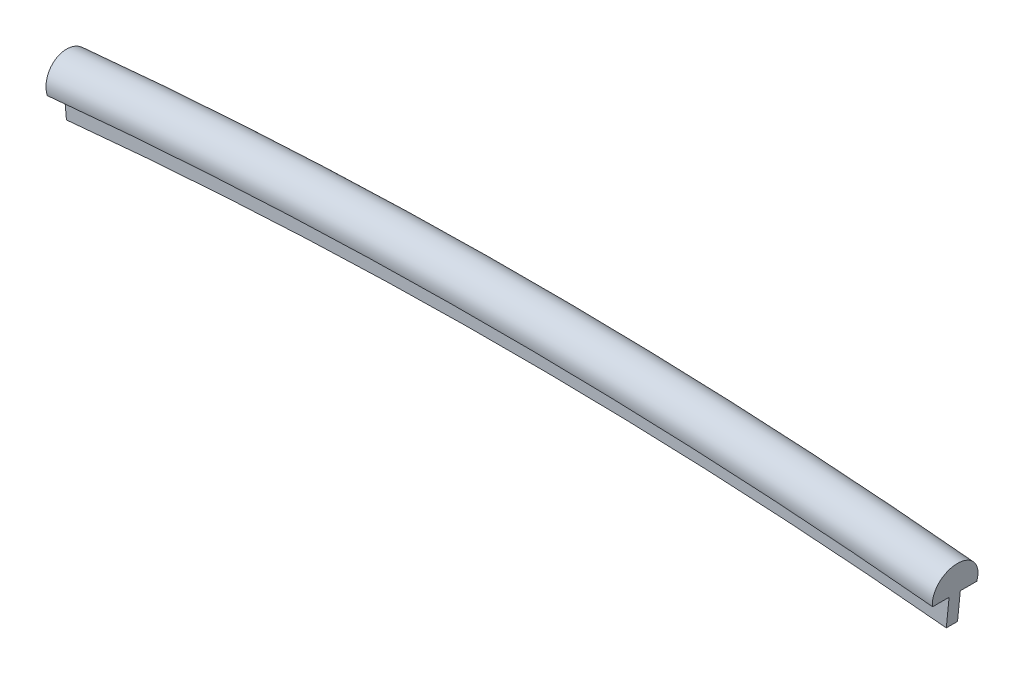
ISO-10303-21;
HEADER;
FILE_DESCRIPTION(('STEP AP214'),'2;1');
FILE_NAME('part.step','',(''),(''),'','','');
FILE_SCHEMA(('AUTOMOTIVE_DESIGN { 1 0 10303 214 1 1 1 1 }'));
ENDSEC;
DATA;
#1=APPLICATION_CONTEXT('core data for automotive mechanical design processes');
#2=APPLICATION_PROTOCOL_DEFINITION('international standard','automotive_design',2000,#1);
#3=PRODUCT_CONTEXT('',#1,'mechanical');
#4=PRODUCT('Part','Part','',(#3));
#5=PRODUCT_RELATED_PRODUCT_CATEGORY('part','',(#4));
#6=PRODUCT_DEFINITION_FORMATION('','',#4);
#7=PRODUCT_DEFINITION_CONTEXT('part definition',#1,'design');
#8=PRODUCT_DEFINITION('design','',#6,#7);
#9=PRODUCT_DEFINITION_SHAPE('','',#8);
#10=(LENGTH_UNIT() NAMED_UNIT(*) SI_UNIT(.MILLI.,.METRE.));
#11=(NAMED_UNIT(*) PLANE_ANGLE_UNIT() SI_UNIT($,.RADIAN.));
#12=(NAMED_UNIT(*) SI_UNIT($,.STERADIAN.) SOLID_ANGLE_UNIT());
#13=UNCERTAINTY_MEASURE_WITH_UNIT(LENGTH_MEASURE(1.E-05),#10,'distance_accuracy_value','');
#14=(GEOMETRIC_REPRESENTATION_CONTEXT(3) GLOBAL_UNCERTAINTY_ASSIGNED_CONTEXT((#13)) GLOBAL_UNIT_ASSIGNED_CONTEXT((#10,
#11,#12)) REPRESENTATION_CONTEXT('',''));
#15=CARTESIAN_POINT('',(0.,0.,0.));
#16=DIRECTION('',(0.,0.,1.));
#17=DIRECTION('',(1.,0.,0.));
#18=AXIS2_PLACEMENT_3D('',#15,#16,#17);
#19=CARTESIAN_POINT('',(0.,0.,70.5976415970385));
#20=DIRECTION('',(0.,0.,1.));
#21=DIRECTION('',(1.,0.,0.));
#22=AXIS2_PLACEMENT_3D('',#19,#20,#21);
#23=CYLINDRICAL_SURFACE('',#22,241.3);
#24=CARTESIAN_POINT('',(0.,0.,1.18));
#25=DIRECTION('',(0.,0.,1.));
#26=DIRECTION('',(1.,0.,0.));
#27=AXIS2_PLACEMENT_3D('',#24,#25,#26);
#28=CIRCLE('',#27,241.3);
#29=CARTESIAN_POINT('',(23.6768612191796,240.135578877449,1.18));
#30=VERTEX_POINT('',#29);
#31=CARTESIAN_POINT('',(-23.6768612191796,240.135578877449,1.18));
#32=VERTEX_POINT('',#31);
#33=EDGE_CURVE('E11',#30,#32,#28,.T.);
#34=ORIENTED_EDGE('',*,*,#33,.T.);
#35=DIRECTION('',(0.,0.,-1.));
#36=VECTOR('',#35,1.);
#37=CARTESIAN_POINT('',(-23.6768612191796,240.135578877449,1.18));
#38=LINE('',#37,#36);
#39=CARTESIAN_POINT('',(-23.6768612191796,240.135578877449,0.3));
#40=VERTEX_POINT('',#39);
#41=EDGE_CURVE('E103',#32,#40,#38,.T.);
#42=ORIENTED_EDGE('',*,*,#41,.T.);
#43=CARTESIAN_POINT('',(0.,0.,0.299999999999995));
#44=DIRECTION('',(0.,0.,1.));
#45=DIRECTION('',(1.,0.,0.));
#46=AXIS2_PLACEMENT_3D('',#43,#44,#45);
#47=CIRCLE('',#46,241.3);
#48=CARTESIAN_POINT('',(23.6768612191796,240.135578877449,0.3));
#49=VERTEX_POINT('',#48);
#50=EDGE_CURVE('E85',#49,#40,#47,.T.);
#51=ORIENTED_EDGE('',*,*,#50,.F.);
#52=DIRECTION('',(0.,0.,-1.));
#53=VECTOR('',#52,1.);
#54=CARTESIAN_POINT('',(23.6768612191796,240.135578877449,1.18));
#55=LINE('',#54,#53);
#56=EDGE_CURVE('E117',#30,#49,#55,.T.);
#57=ORIENTED_EDGE('',*,*,#56,.F.);
#58=EDGE_LOOP('',(#34,#42,#51,#57));
#59=FACE_BOUND('',#58,.T.);
#60=ADVANCED_FACE('F33',(#59),#23,.F.);
#61=CARTESIAN_POINT('',(0.,0.,0.));
#62=DIRECTION('',(0.,0.,1.));
#63=DIRECTION('',(1.,0.,0.));
#64=AXIS2_PLACEMENT_3D('',#61,#62,#63);
#65=TOROIDAL_SURFACE('',#64,241.586013989906,1.21416802890791);
#66=CARTESIAN_POINT('',(0.,0.,-1.18));
#67=DIRECTION('',(0.,0.,1.));
#68=DIRECTION('',(1.,0.,0.));
#69=AXIS2_PLACEMENT_3D('',#66,#67,#68);
#70=CIRCLE('',#69,241.3);
#71=CARTESIAN_POINT('',(23.6768612191796,240.135578877449,-1.18));
#72=VERTEX_POINT('',#71);
#73=CARTESIAN_POINT('',(-23.6768612191796,240.135578877449,-1.18));
#74=VERTEX_POINT('',#73);
#75=EDGE_CURVE('E41',#72,#74,#70,.T.);
#76=ORIENTED_EDGE('',*,*,#75,.T.);
#77=CARTESIAN_POINT('',(-23.7049255107078,240.420212673691,0.));
#78=DIRECTION('',(0.995174384075629,0.0981220937388297,0.));
#79=DIRECTION('',(0.,0.,1.));
#80=AXIS2_PLACEMENT_3D('',#77,#78,#79);
#81=CIRCLE('',#80,1.21416802890791);
#82=EDGE_CURVE('E115',#74,#32,#81,.T.);
#83=ORIENTED_EDGE('',*,*,#82,.T.);
#84=ORIENTED_EDGE('',*,*,#33,.F.);
#85=CARTESIAN_POINT('',(23.7049255107078,240.420212673691,0.));
#86=DIRECTION('',(0.995174384075629,-0.0981220937388297,0.));
#87=DIRECTION('',(0.,0.,1.));
#88=AXIS2_PLACEMENT_3D('',#85,#86,#87);
#89=CIRCLE('',#88,1.21416802890791);
#90=EDGE_CURVE('E97',#72,#30,#89,.T.);
#91=ORIENTED_EDGE('',*,*,#90,.F.);
#92=EDGE_LOOP('',(#76,#83,#84,#91));
#93=FACE_BOUND('',#92,.T.);
#94=ADVANCED_FACE('F35',(#93),#65,.T.);
#95=CARTESIAN_POINT('',(0.,0.,70.5976415970385));
#96=DIRECTION('',(0.,0.,1.));
#97=DIRECTION('',(1.,0.,0.));
#98=AXIS2_PLACEMENT_3D('',#95,#96,#97);
#99=CYLINDRICAL_SURFACE('',#98,241.3);
#100=CARTESIAN_POINT('',(0.,0.,-0.299999999999995));
#101=DIRECTION('',(0.,0.,1.));
#102=DIRECTION('',(1.,0.,0.));
#103=AXIS2_PLACEMENT_3D('',#100,#101,#102);
#104=CIRCLE('',#103,241.3);
#105=CARTESIAN_POINT('',(23.6768612191796,240.135578877449,-0.3));
#106=VERTEX_POINT('',#105);
#107=CARTESIAN_POINT('',(-23.6768612191796,240.135578877449,-0.3));
#108=VERTEX_POINT('',#107);
#109=EDGE_CURVE('E132',#106,#108,#104,.T.);
#110=ORIENTED_EDGE('',*,*,#109,.T.);
#111=DIRECTION('',(0.,0.,-1.));
#112=VECTOR('',#111,1.);
#113=CARTESIAN_POINT('',(-23.6768612191796,240.135578877449,-0.3));
#114=LINE('',#113,#112);
#115=EDGE_CURVE('E113',#108,#74,#114,.T.);
#116=ORIENTED_EDGE('',*,*,#115,.T.);
#117=ORIENTED_EDGE('',*,*,#75,.F.);
#118=DIRECTION('',(0.,0.,-1.));
#119=VECTOR('',#118,1.);
#120=CARTESIAN_POINT('',(23.6768612191796,240.135578877449,-0.3));
#121=LINE('',#120,#119);
#122=EDGE_CURVE('E125',#106,#72,#121,.T.);
#123=ORIENTED_EDGE('',*,*,#122,.F.);
#124=EDGE_LOOP('',(#110,#116,#117,#123));
#125=FACE_BOUND('',#124,.T.);
#126=ADVANCED_FACE('F134',(#125),#99,.F.);
#127=CARTESIAN_POINT('',(23.5296780785714,238.642817301336,-0.3));
#128=DIRECTION('',(0.,0.,1.));
#129=DIRECTION('',(1.,0.,0.));
#130=AXIS2_PLACEMENT_3D('',#127,#128,#129);
#131=PLANE('',#130);
#132=CARTESIAN_POINT('',(0.,0.,-0.299999999999995));
#133=DIRECTION('',(0.,0.,1.));
#134=DIRECTION('',(1.,0.,0.));
#135=AXIS2_PLACEMENT_3D('',#132,#133,#134);
#136=CIRCLE('',#135,239.8);
#137=CARTESIAN_POINT('',(23.5296780785714,238.642817301336,-0.3));
#138=VERTEX_POINT('',#137);
#139=CARTESIAN_POINT('',(-23.5296780785714,238.642817301336,-0.3));
#140=VERTEX_POINT('',#139);
#141=EDGE_CURVE('E129',#138,#140,#136,.T.);
#142=ORIENTED_EDGE('',*,*,#141,.T.);
#143=DIRECTION('',(-0.0981220937388297,0.995174384075629,0.));
#144=VECTOR('',#143,1.);
#145=CARTESIAN_POINT('',(-23.5296780785714,238.642817301336,-0.3));
#146=LINE('',#145,#144);
#147=EDGE_CURVE('E110',#140,#108,#146,.T.);
#148=ORIENTED_EDGE('',*,*,#147,.T.);
#149=ORIENTED_EDGE('',*,*,#109,.F.);
#150=DIRECTION('',(0.0981220937388297,0.995174384075629,0.));
#151=VECTOR('',#150,1.);
#152=CARTESIAN_POINT('',(23.5296780785714,238.642817301336,-0.3));
#153=LINE('',#152,#151);
#154=EDGE_CURVE('E122',#138,#106,#153,.T.);
#155=ORIENTED_EDGE('',*,*,#154,.F.);
#156=EDGE_LOOP('',(#142,#148,#149,#155));
#157=FACE_BOUND('',#156,.T.);
#158=ADVANCED_FACE('F136',(#157),#131,.F.);
#159=CARTESIAN_POINT('',(0.,0.,70.5976415970385));
#160=DIRECTION('',(0.,0.,1.));
#161=DIRECTION('',(1.,0.,0.));
#162=AXIS2_PLACEMENT_3D('',#159,#160,#161);
#163=CYLINDRICAL_SURFACE('',#162,239.8);
#164=CARTESIAN_POINT('',(0.,0.,0.299999999999995));
#165=DIRECTION('',(0.,0.,1.));
#166=DIRECTION('',(1.,0.,0.));
#167=AXIS2_PLACEMENT_3D('',#164,#165,#166);
#168=CIRCLE('',#167,239.8);
#169=CARTESIAN_POINT('',(23.5296780785714,238.642817301336,0.3));
#170=VERTEX_POINT('',#169);
#171=CARTESIAN_POINT('',(-23.5296780785714,238.642817301336,0.3));
#172=VERTEX_POINT('',#171);
#173=EDGE_CURVE('E96',#170,#172,#168,.T.);
#174=ORIENTED_EDGE('',*,*,#173,.T.);
#175=DIRECTION('',(0.,0.,-1.));
#176=VECTOR('',#175,1.);
#177=CARTESIAN_POINT('',(-23.5296780785714,238.642817301336,0.));
#178=LINE('',#177,#176);
#179=EDGE_CURVE('E105',#172,#140,#178,.T.);
#180=ORIENTED_EDGE('',*,*,#179,.T.);
#181=ORIENTED_EDGE('',*,*,#141,.F.);
#182=DIRECTION('',(0.,0.,-1.));
#183=VECTOR('',#182,1.);
#184=CARTESIAN_POINT('',(23.5296780785714,238.642817301336,0.));
#185=LINE('',#184,#183);
#186=EDGE_CURVE('E120',#170,#138,#185,.T.);
#187=ORIENTED_EDGE('',*,*,#186,.F.);
#188=EDGE_LOOP('',(#174,#180,#181,#187));
#189=FACE_BOUND('',#188,.T.);
#190=ADVANCED_FACE('F141',(#189),#163,.F.);
#191=CARTESIAN_POINT('',(23.5296780785714,238.642817301336,0.3));
#192=DIRECTION('',(0.,0.,-1.));
#193=DIRECTION('',(-1.,0.,0.));
#194=AXIS2_PLACEMENT_3D('',#191,#192,#193);
#195=PLANE('',#194);
#196=DIRECTION('',(-0.0981220937388297,-0.995174384075629,0.));
#197=VECTOR('',#196,1.);
#198=CARTESIAN_POINT('',(23.5296780785714,238.642817301336,0.3));
#199=LINE('',#198,#197);
#200=EDGE_CURVE('E91',#49,#170,#199,.T.);
#201=ORIENTED_EDGE('',*,*,#200,.F.);
#202=ORIENTED_EDGE('',*,*,#50,.T.);
#203=DIRECTION('',(0.0981220937388297,-0.995174384075629,0.));
#204=VECTOR('',#203,1.);
#205=CARTESIAN_POINT('',(-23.5296780785714,238.642817301336,0.3));
#206=LINE('',#205,#204);
#207=EDGE_CURVE('E88',#40,#172,#206,.T.);
#208=ORIENTED_EDGE('',*,*,#207,.T.);
#209=ORIENTED_EDGE('',*,*,#173,.F.);
#210=EDGE_LOOP('',(#201,#202,#208,#209));
#211=FACE_BOUND('',#210,.T.);
#212=ADVANCED_FACE('F87',(#211),#195,.F.);
#213=CARTESIAN_POINT('',(23.7049255107078,240.420212673691,0.));
#214=DIRECTION('',(-0.995174384075629,0.0981220937388297,0.));
#215=DIRECTION('',(0.,0.,1.));
#216=AXIS2_PLACEMENT_3D('',#213,#214,#215);
#217=PLANE('',#216);
#218=ORIENTED_EDGE('',*,*,#56,.T.);
#219=ORIENTED_EDGE('',*,*,#200,.T.);
#220=ORIENTED_EDGE('',*,*,#186,.T.);
#221=ORIENTED_EDGE('',*,*,#154,.T.);
#222=ORIENTED_EDGE('',*,*,#122,.T.);
#223=ORIENTED_EDGE('',*,*,#90,.T.);
#224=EDGE_LOOP('',(#218,#219,#220,#221,#222,#223));
#225=FACE_BOUND('',#224,.T.);
#226=ADVANCED_FACE('F143',(#225),#217,.F.);
#227=CARTESIAN_POINT('',(-23.7049255107078,240.420212673691,0.));
#228=DIRECTION('',(-0.995174384075629,-0.0981220937388297,0.));
#229=DIRECTION('',(0.,0.,1.));
#230=AXIS2_PLACEMENT_3D('',#227,#228,#229);
#231=PLANE('',#230);
#232=ORIENTED_EDGE('',*,*,#41,.F.);
#233=ORIENTED_EDGE('',*,*,#82,.F.);
#234=ORIENTED_EDGE('',*,*,#115,.F.);
#235=ORIENTED_EDGE('',*,*,#147,.F.);
#236=ORIENTED_EDGE('',*,*,#179,.F.);
#237=ORIENTED_EDGE('',*,*,#207,.F.);
#238=EDGE_LOOP('',(#232,#233,#234,#235,#236,#237));
#239=FACE_BOUND('',#238,.T.);
#240=ADVANCED_FACE('F101',(#239),#231,.T.);
#241=CLOSED_SHELL('',(#60,#94,#126,#158,#190,#212,#226,#240));
#242=MANIFOLD_SOLID_BREP('B2',#241);
#243=ADVANCED_BREP_SHAPE_REPRESENTATION('',(#18,#242),#14);
#244=SHAPE_DEFINITION_REPRESENTATION(#9,#243);
ENDSEC;
END-ISO-10303-21;
